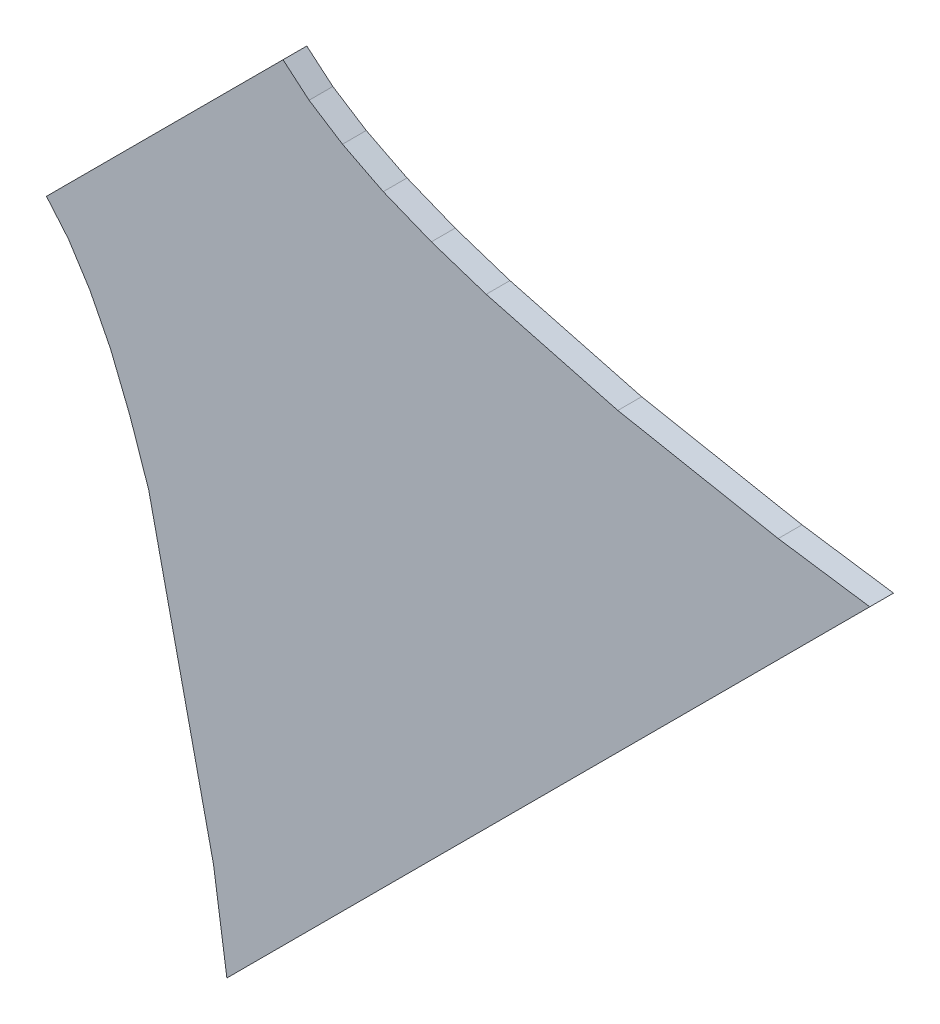
ISO-10303-21;
HEADER;
FILE_DESCRIPTION(('STEP AP214'),'2;1');
FILE_NAME('part.step','',(''),(''),'','','');
FILE_SCHEMA(('AUTOMOTIVE_DESIGN { 1 0 10303 214 1 1 1 1 }'));
ENDSEC;
DATA;
#1=APPLICATION_CONTEXT('core data for automotive mechanical design processes');
#2=APPLICATION_PROTOCOL_DEFINITION('international standard','automotive_design',2000,#1);
#3=PRODUCT_CONTEXT('',#1,'mechanical');
#4=PRODUCT('Part','Part','',(#3));
#5=PRODUCT_RELATED_PRODUCT_CATEGORY('part','',(#4));
#6=PRODUCT_DEFINITION_FORMATION('','',#4);
#7=PRODUCT_DEFINITION_CONTEXT('part definition',#1,'design');
#8=PRODUCT_DEFINITION('design','',#6,#7);
#9=PRODUCT_DEFINITION_SHAPE('','',#8);
#10=(LENGTH_UNIT() NAMED_UNIT(*) SI_UNIT(.MILLI.,.METRE.));
#11=(NAMED_UNIT(*) PLANE_ANGLE_UNIT() SI_UNIT($,.RADIAN.));
#12=(NAMED_UNIT(*) SI_UNIT($,.STERADIAN.) SOLID_ANGLE_UNIT());
#13=UNCERTAINTY_MEASURE_WITH_UNIT(LENGTH_MEASURE(1.E-05),#10,'distance_accuracy_value','');
#14=(GEOMETRIC_REPRESENTATION_CONTEXT(3) GLOBAL_UNCERTAINTY_ASSIGNED_CONTEXT((#13)) GLOBAL_UNIT_ASSIGNED_CONTEXT((#10,
#11,#12)) REPRESENTATION_CONTEXT('',''));
#15=CARTESIAN_POINT('',(0.,0.,0.));
#16=DIRECTION('',(0.,0.,1.));
#17=DIRECTION('',(1.,0.,0.));
#18=AXIS2_PLACEMENT_3D('',#15,#16,#17);
#19=CARTESIAN_POINT('',(66.468002319336,76.0579986572266,0.));
#20=DIRECTION('',(0.763425936268127,0.645895378395862,0.));
#21=DIRECTION('',(0.645895378395862,-0.763425936268127,0.));
#22=AXIS2_PLACEMENT_3D('',#19,#20,#21);
#23=PLANE('',#22);
#24=DIRECTION('',(0.645895378395862,-0.763425936268127,0.));
#25=VECTOR('',#24,1.);
#26=CARTESIAN_POINT('',(66.4680023193359,76.0579986572266,0.03556));
#27=LINE('',#26,#25);
#28=CARTESIAN_POINT('',(66.4680023193359,76.0579986572266,0.03556));
#29=VERTEX_POINT('',#28);
#30=CARTESIAN_POINT('',(66.5009994506836,76.0189971923828,0.03556));
#31=VERTEX_POINT('',#30);
#32=EDGE_CURVE('E11',#29,#31,#27,.T.);
#33=ORIENTED_EDGE('',*,*,#32,.F.);
#34=DIRECTION('',(0.,0.,1.));
#35=VECTOR('',#34,1.);
#36=CARTESIAN_POINT('',(66.4680023193359,76.0579986572266,0.));
#37=LINE('',#36,#35);
#38=CARTESIAN_POINT('',(66.4680023193359,76.0579986572266,0.));
#39=VERTEX_POINT('',#38);
#40=EDGE_CURVE('E24',#39,#29,#37,.T.);
#41=ORIENTED_EDGE('',*,*,#40,.F.);
#42=DIRECTION('',(0.645895378395862,-0.763425936268127,0.));
#43=VECTOR('',#42,1.);
#44=CARTESIAN_POINT('',(66.4680023193359,76.0579986572266,0.));
#45=LINE('',#44,#43);
#46=CARTESIAN_POINT('',(66.5009994506836,76.0189971923828,0.));
#47=VERTEX_POINT('',#46);
#48=EDGE_CURVE('E154',#39,#47,#45,.T.);
#49=ORIENTED_EDGE('',*,*,#48,.T.);
#50=DIRECTION('',(0.,0.,1.));
#51=VECTOR('',#50,1.);
#52=CARTESIAN_POINT('',(66.5009994506836,76.0189971923828,0.));
#53=LINE('',#52,#51);
#54=EDGE_CURVE('E37',#47,#31,#53,.T.);
#55=ORIENTED_EDGE('',*,*,#54,.T.);
#56=EDGE_LOOP('',(#33,#41,#49,#55));
#57=FACE_BOUND('',#56,.T.);
#58=ADVANCED_FACE('F17',(#57),#23,.F.);
#59=CARTESIAN_POINT('',(66.5009994506836,76.0189971923828,0.));
#60=DIRECTION('',(0.842266732063425,0.539060991038304,0.));
#61=DIRECTION('',(0.539060991038304,-0.842266732063425,0.));
#62=AXIS2_PLACEMENT_3D('',#59,#60,#61);
#63=PLANE('',#62);
#64=DIRECTION('',(0.539060991038304,-0.842266732063425,0.));
#65=VECTOR('',#64,1.);
#66=CARTESIAN_POINT('',(66.5009994506836,76.0189971923828,0.03556));
#67=LINE('',#66,#65);
#68=CARTESIAN_POINT('',(66.5329971313477,75.9690017700195,0.03556));
#69=VERTEX_POINT('',#68);
#70=EDGE_CURVE('E266',#31,#69,#67,.T.);
#71=ORIENTED_EDGE('',*,*,#70,.F.);
#72=ORIENTED_EDGE('',*,*,#54,.F.);
#73=DIRECTION('',(0.539060991038304,-0.842266732063425,0.));
#74=VECTOR('',#73,1.);
#75=CARTESIAN_POINT('',(66.5009994506836,76.0189971923828,0.));
#76=LINE('',#75,#74);
#77=CARTESIAN_POINT('',(66.5329971313477,75.9690017700195,0.));
#78=VERTEX_POINT('',#77);
#79=EDGE_CURVE('E263',#47,#78,#76,.T.);
#80=ORIENTED_EDGE('',*,*,#79,.T.);
#81=DIRECTION('',(0.,0.,1.));
#82=VECTOR('',#81,1.);
#83=CARTESIAN_POINT('',(66.5329971313477,75.9690017700195,0.));
#84=LINE('',#83,#82);
#85=EDGE_CURVE('E261',#78,#69,#84,.T.);
#86=ORIENTED_EDGE('',*,*,#85,.T.);
#87=EDGE_LOOP('',(#71,#72,#80,#86));
#88=FACE_BOUND('',#87,.T.);
#89=ADVANCED_FACE('F274',(#88),#63,.F.);
#90=CARTESIAN_POINT('',(66.5329971313477,75.9690017700195,0.));
#91=DIRECTION('',(0.891464515087976,0.453090518924154,0.));
#92=DIRECTION('',(0.453090518924154,-0.891464515087976,0.));
#93=AXIS2_PLACEMENT_3D('',#90,#91,#92);
#94=PLANE('',#93);
#95=DIRECTION('',(0.453090518924154,-0.891464515087976,0.));
#96=VECTOR('',#95,1.);
#97=CARTESIAN_POINT('',(66.5329971313477,75.9690017700195,0.03556));
#98=LINE('',#97,#96);
#99=CARTESIAN_POINT('',(66.5640029907227,75.9079971313477,0.03556));
#100=VERTEX_POINT('',#99);
#101=EDGE_CURVE('E258',#69,#100,#98,.T.);
#102=ORIENTED_EDGE('',*,*,#101,.F.);
#103=ORIENTED_EDGE('',*,*,#85,.F.);
#104=DIRECTION('',(0.453090518924154,-0.891464515087976,0.));
#105=VECTOR('',#104,1.);
#106=CARTESIAN_POINT('',(66.5329971313477,75.9690017700195,0.));
#107=LINE('',#106,#105);
#108=CARTESIAN_POINT('',(66.5640029907227,75.9079971313477,0.));
#109=VERTEX_POINT('',#108);
#110=EDGE_CURVE('E255',#78,#109,#107,.T.);
#111=ORIENTED_EDGE('',*,*,#110,.T.);
#112=DIRECTION('',(0.,0.,1.));
#113=VECTOR('',#112,1.);
#114=CARTESIAN_POINT('',(66.5640029907227,75.9079971313477,0.));
#115=LINE('',#114,#113);
#116=EDGE_CURVE('E253',#109,#100,#115,.T.);
#117=ORIENTED_EDGE('',*,*,#116,.T.);
#118=EDGE_LOOP('',(#102,#103,#111,#117));
#119=FACE_BOUND('',#118,.T.);
#120=ADVANCED_FACE('F280',(#119),#94,.F.);
#121=CARTESIAN_POINT('',(66.5640029907227,75.9079971313477,0.));
#122=DIRECTION('',(0.927586015125425,0.373609668696804,0.));
#123=DIRECTION('',(0.373609668696804,-0.927586015125425,0.));
#124=AXIS2_PLACEMENT_3D('',#121,#122,#123);
#125=PLANE('',#124);
#126=DIRECTION('',(0.373609668696804,-0.927586015125425,0.));
#127=VECTOR('',#126,1.);
#128=CARTESIAN_POINT('',(66.5640029907227,75.9079971313477,0.03556));
#129=LINE('',#128,#127);
#130=CARTESIAN_POINT('',(66.5930023193359,75.8359985351562,0.03556));
#131=VERTEX_POINT('',#130);
#132=EDGE_CURVE('E250',#100,#131,#129,.T.);
#133=ORIENTED_EDGE('',*,*,#132,.F.);
#134=ORIENTED_EDGE('',*,*,#116,.F.);
#135=DIRECTION('',(0.373609668696804,-0.927586015125425,0.));
#136=VECTOR('',#135,1.);
#137=CARTESIAN_POINT('',(66.5640029907227,75.9079971313477,0.));
#138=LINE('',#137,#136);
#139=CARTESIAN_POINT('',(66.5930023193359,75.8359985351562,0.));
#140=VERTEX_POINT('',#139);
#141=EDGE_CURVE('E247',#109,#140,#138,.T.);
#142=ORIENTED_EDGE('',*,*,#141,.T.);
#143=DIRECTION('',(0.,0.,1.));
#144=VECTOR('',#143,1.);
#145=CARTESIAN_POINT('',(66.5930023193359,75.8359985351562,0.));
#146=LINE('',#145,#144);
#147=EDGE_CURVE('E245',#140,#131,#146,.T.);
#148=ORIENTED_EDGE('',*,*,#147,.T.);
#149=EDGE_LOOP('',(#133,#134,#142,#148));
#150=FACE_BOUND('',#149,.T.);
#151=ADVANCED_FACE('F282',(#150),#125,.F.);
#152=CARTESIAN_POINT('',(66.593002319336,75.8359985351562,0.));
#153=DIRECTION('',(0.946351169524934,0.323140006713482,0.));
#154=DIRECTION('',(0.323140006713482,-0.946351169524934,0.));
#155=AXIS2_PLACEMENT_3D('',#152,#153,#154);
#156=PLANE('',#155);
#157=DIRECTION('',(0.323140006713482,-0.946351169524934,0.));
#158=VECTOR('',#157,1.);
#159=CARTESIAN_POINT('',(66.5930023193359,75.8359985351562,0.03556));
#160=LINE('',#159,#158);
#161=CARTESIAN_POINT('',(66.6210021972656,75.7539978027344,0.03556));
#162=VERTEX_POINT('',#161);
#163=EDGE_CURVE('E242',#131,#162,#160,.T.);
#164=ORIENTED_EDGE('',*,*,#163,.F.);
#165=ORIENTED_EDGE('',*,*,#147,.F.);
#166=DIRECTION('',(0.323140006713482,-0.946351169524934,0.));
#167=VECTOR('',#166,1.);
#168=CARTESIAN_POINT('',(66.5930023193359,75.8359985351562,0.));
#169=LINE('',#168,#167);
#170=CARTESIAN_POINT('',(66.6210021972656,75.7539978027344,0.));
#171=VERTEX_POINT('',#170);
#172=EDGE_CURVE('E239',#140,#171,#169,.T.);
#173=ORIENTED_EDGE('',*,*,#172,.T.);
#174=DIRECTION('',(0.,0.,1.));
#175=VECTOR('',#174,1.);
#176=CARTESIAN_POINT('',(66.6210021972656,75.7539978027344,0.));
#177=LINE('',#176,#175);
#178=EDGE_CURVE('E237',#171,#162,#177,.T.);
#179=ORIENTED_EDGE('',*,*,#178,.T.);
#180=EDGE_LOOP('',(#164,#165,#173,#179));
#181=FACE_BOUND('',#180,.T.);
#182=ADVANCED_FACE('F287',(#181),#156,.F.);
#183=CARTESIAN_POINT('',(66.6210021972656,75.7539978027344,0.));
#184=DIRECTION('',(0.97623916620404,0.216695847604982,0.));
#185=DIRECTION('',(0.216695847604982,-0.97623916620404,0.));
#186=AXIS2_PLACEMENT_3D('',#183,#184,#185);
#187=PLANE('',#186);
#188=DIRECTION('',(0.216695847604982,-0.97623916620404,0.));
#189=VECTOR('',#188,1.);
#190=CARTESIAN_POINT('',(66.6210021972656,75.7539978027344,0.03556));
#191=LINE('',#190,#189);
#192=CARTESIAN_POINT('',(66.7180023193359,75.3170013427734,0.03556));
#193=VERTEX_POINT('',#192);
#194=EDGE_CURVE('E234',#162,#193,#191,.T.);
#195=ORIENTED_EDGE('',*,*,#194,.F.);
#196=ORIENTED_EDGE('',*,*,#178,.F.);
#197=DIRECTION('',(0.216695847604982,-0.97623916620404,0.));
#198=VECTOR('',#197,1.);
#199=CARTESIAN_POINT('',(66.6210021972656,75.7539978027344,0.));
#200=LINE('',#199,#198);
#201=CARTESIAN_POINT('',(66.7180023193359,75.3170013427734,0.));
#202=VERTEX_POINT('',#201);
#203=EDGE_CURVE('E231',#171,#202,#200,.T.);
#204=ORIENTED_EDGE('',*,*,#203,.T.);
#205=DIRECTION('',(0.,0.,1.));
#206=VECTOR('',#205,1.);
#207=CARTESIAN_POINT('',(66.7180023193359,75.3170013427734,0.));
#208=LINE('',#207,#206);
#209=EDGE_CURVE('E229',#202,#193,#208,.T.);
#210=ORIENTED_EDGE('',*,*,#209,.T.);
#211=EDGE_LOOP('',(#195,#196,#204,#210));
#212=FACE_BOUND('',#211,.T.);
#213=ADVANCED_FACE('F290',(#212),#187,.F.);
#214=CARTESIAN_POINT('',(66.718002319336,75.3170013427734,0.));
#215=DIRECTION('',(0.989515104847353,0.144429419714034,0.));
#216=DIRECTION('',(0.144429419714034,-0.989515104847353,0.));
#217=AXIS2_PLACEMENT_3D('',#214,#215,#216);
#218=PLANE('',#217);
#219=DIRECTION('',(0.144429419714034,-0.989515104847353,0.));
#220=VECTOR('',#219,1.);
#221=CARTESIAN_POINT('',(66.7180023193359,75.3170013427734,0.03556));
#222=LINE('',#221,#220);
#223=CARTESIAN_POINT('',(66.7379989624023,75.1800003051758,0.03556));
#224=VERTEX_POINT('',#223);
#225=EDGE_CURVE('E226',#193,#224,#222,.T.);
#226=ORIENTED_EDGE('',*,*,#225,.F.);
#227=ORIENTED_EDGE('',*,*,#209,.F.);
#228=DIRECTION('',(0.144429419714034,-0.989515104847353,0.));
#229=VECTOR('',#228,1.);
#230=CARTESIAN_POINT('',(66.7180023193359,75.3170013427734,0.));
#231=LINE('',#230,#229);
#232=CARTESIAN_POINT('',(66.7379989624023,75.1800003051758,0.));
#233=VERTEX_POINT('',#232);
#234=EDGE_CURVE('E223',#202,#233,#231,.T.);
#235=ORIENTED_EDGE('',*,*,#234,.T.);
#236=DIRECTION('',(0.,0.,1.));
#237=VECTOR('',#236,1.);
#238=CARTESIAN_POINT('',(66.7379989624023,75.1800003051758,0.));
#239=LINE('',#238,#237);
#240=EDGE_CURVE('E221',#233,#224,#239,.T.);
#241=ORIENTED_EDGE('',*,*,#240,.T.);
#242=EDGE_LOOP('',(#226,#227,#235,#241));
#243=FACE_BOUND('',#242,.T.);
#244=ADVANCED_FACE('F295',(#243),#218,.F.);
#245=CARTESIAN_POINT('',(66.7379989624023,75.1800003051758,0.));
#246=DIRECTION('',(-0.707106781186548,0.707106781186548,0.));
#247=DIRECTION('',(0.707106781186548,0.707106781186548,0.));
#248=AXIS2_PLACEMENT_3D('',#245,#246,#247);
#249=PLANE('',#248);
#250=DIRECTION('',(0.707106781186548,0.707106781186548,0.));
#251=VECTOR('',#250,1.);
#252=CARTESIAN_POINT('',(66.7379989624023,75.1800003051758,0.03556));
#253=LINE('',#252,#251);
#254=CARTESIAN_POINT('',(67.6999969482422,76.1419982910156,0.03556));
#255=VERTEX_POINT('',#254);
#256=EDGE_CURVE('E218',#224,#255,#253,.T.);
#257=ORIENTED_EDGE('',*,*,#256,.F.);
#258=ORIENTED_EDGE('',*,*,#240,.F.);
#259=DIRECTION('',(0.707106781186548,0.707106781186548,0.));
#260=VECTOR('',#259,1.);
#261=CARTESIAN_POINT('',(66.7379989624023,75.1800003051758,0.));
#262=LINE('',#261,#260);
#263=CARTESIAN_POINT('',(67.6999969482422,76.1419982910156,0.));
#264=VERTEX_POINT('',#263);
#265=EDGE_CURVE('E215',#233,#264,#262,.T.);
#266=ORIENTED_EDGE('',*,*,#265,.T.);
#267=DIRECTION('',(0.,0.,1.));
#268=VECTOR('',#267,1.);
#269=CARTESIAN_POINT('',(67.6999969482422,76.1419982910156,0.));
#270=LINE('',#269,#268);
#271=EDGE_CURVE('E213',#264,#255,#270,.T.);
#272=ORIENTED_EDGE('',*,*,#271,.T.);
#273=EDGE_LOOP('',(#257,#258,#266,#272));
#274=FACE_BOUND('',#273,.T.);
#275=ADVANCED_FACE('F298',(#274),#249,.F.);
#276=CARTESIAN_POINT('',(67.6999969482422,76.1419982910156,0.));
#277=DIRECTION('',(-0.144491252828946,-0.989506077725611,0.));
#278=DIRECTION('',(-0.989506077725611,0.144491252828946,0.));
#279=AXIS2_PLACEMENT_3D('',#276,#277,#278);
#280=PLANE('',#279);
#281=DIRECTION('',(-0.989506077725611,0.144491252828946,0.));
#282=VECTOR('',#281,1.);
#283=CARTESIAN_POINT('',(67.6999969482422,76.1419982910156,0.03556));
#284=LINE('',#283,#282);
#285=CARTESIAN_POINT('',(67.5630035400391,76.1620025634766,0.03556));
#286=VERTEX_POINT('',#285);
#287=EDGE_CURVE('E210',#255,#286,#284,.T.);
#288=ORIENTED_EDGE('',*,*,#287,.F.);
#289=ORIENTED_EDGE('',*,*,#271,.F.);
#290=DIRECTION('',(-0.989506077725611,0.144491252828946,0.));
#291=VECTOR('',#290,1.);
#292=CARTESIAN_POINT('',(67.6999969482422,76.1419982910156,0.));
#293=LINE('',#292,#291);
#294=CARTESIAN_POINT('',(67.5630035400391,76.1620025634766,0.));
#295=VERTEX_POINT('',#294);
#296=EDGE_CURVE('E207',#264,#295,#293,.T.);
#297=ORIENTED_EDGE('',*,*,#296,.T.);
#298=DIRECTION('',(0.,0.,1.));
#299=VECTOR('',#298,1.);
#300=CARTESIAN_POINT('',(67.5630035400391,76.1620025634766,0.));
#301=LINE('',#300,#299);
#302=EDGE_CURVE('E205',#295,#286,#301,.T.);
#303=ORIENTED_EDGE('',*,*,#302,.T.);
#304=EDGE_LOOP('',(#288,#289,#297,#303));
#305=FACE_BOUND('',#304,.T.);
#306=ADVANCED_FACE('F303',(#305),#280,.F.);
#307=CARTESIAN_POINT('',(67.5630035400391,76.1620025634766,0.));
#308=DIRECTION('',(-0.188226692657996,-0.982125609161594,0.));
#309=DIRECTION('',(-0.982125609161594,0.188226692657996,0.));
#310=AXIS2_PLACEMENT_3D('',#307,#308,#309);
#311=PLANE('',#310);
#312=DIRECTION('',(-0.982125609161594,0.188226692657996,0.));
#313=VECTOR('',#312,1.);
#314=CARTESIAN_POINT('',(67.5630035400391,76.1620025634766,0.03556));
#315=LINE('',#314,#313);
#316=CARTESIAN_POINT('',(67.322998046875,76.2080001831055,0.03556));
#317=VERTEX_POINT('',#316);
#318=EDGE_CURVE('E202',#286,#317,#315,.T.);
#319=ORIENTED_EDGE('',*,*,#318,.F.);
#320=ORIENTED_EDGE('',*,*,#302,.F.);
#321=DIRECTION('',(-0.982125609161594,0.188226692657996,0.));
#322=VECTOR('',#321,1.);
#323=CARTESIAN_POINT('',(67.5630035400391,76.1620025634766,0.));
#324=LINE('',#323,#322);
#325=CARTESIAN_POINT('',(67.322998046875,76.2080001831055,0.));
#326=VERTEX_POINT('',#325);
#327=EDGE_CURVE('E199',#295,#326,#324,.T.);
#328=ORIENTED_EDGE('',*,*,#327,.T.);
#329=DIRECTION('',(0.,0.,1.));
#330=VECTOR('',#329,1.);
#331=CARTESIAN_POINT('',(67.322998046875,76.2080001831055,0.));
#332=LINE('',#331,#330);
#333=EDGE_CURVE('E197',#326,#317,#332,.T.);
#334=ORIENTED_EDGE('',*,*,#333,.T.);
#335=EDGE_LOOP('',(#319,#320,#328,#334));
#336=FACE_BOUND('',#335,.T.);
#337=ADVANCED_FACE('F306',(#336),#311,.F.);
#338=CARTESIAN_POINT('',(67.322998046875,76.2080001831055,0.));
#339=DIRECTION('',(-0.255228651788377,-0.966880724446551,0.));
#340=DIRECTION('',(-0.966880724446551,0.255228651788377,0.));
#341=AXIS2_PLACEMENT_3D('',#338,#339,#340);
#342=PLANE('',#341);
#343=DIRECTION('',(-0.966880724446551,0.255228651788377,0.));
#344=VECTOR('',#343,1.);
#345=CARTESIAN_POINT('',(67.322998046875,76.2080001831055,0.03556));
#346=LINE('',#345,#344);
#347=CARTESIAN_POINT('',(67.1259994506836,76.2600021362305,0.03556));
#348=VERTEX_POINT('',#347);
#349=EDGE_CURVE('E194',#317,#348,#346,.T.);
#350=ORIENTED_EDGE('',*,*,#349,.F.);
#351=ORIENTED_EDGE('',*,*,#333,.F.);
#352=DIRECTION('',(-0.966880724446551,0.255228651788377,0.));
#353=VECTOR('',#352,1.);
#354=CARTESIAN_POINT('',(67.322998046875,76.2080001831055,0.));
#355=LINE('',#354,#353);
#356=CARTESIAN_POINT('',(67.1259994506836,76.2600021362305,0.));
#357=VERTEX_POINT('',#356);
#358=EDGE_CURVE('E191',#326,#357,#355,.T.);
#359=ORIENTED_EDGE('',*,*,#358,.T.);
#360=DIRECTION('',(0.,0.,1.));
#361=VECTOR('',#360,1.);
#362=CARTESIAN_POINT('',(67.1259994506836,76.2600021362305,0.));
#363=LINE('',#362,#361);
#364=EDGE_CURVE('E189',#357,#348,#363,.T.);
#365=ORIENTED_EDGE('',*,*,#364,.T.);
#366=EDGE_LOOP('',(#350,#351,#359,#365));
#367=FACE_BOUND('',#366,.T.);
#368=ADVANCED_FACE('F311',(#367),#342,.F.);
#369=CARTESIAN_POINT('',(67.1259994506836,76.2600021362305,0.));
#370=DIRECTION('',(-0.312752582059084,-0.949834628983054,0.));
#371=DIRECTION('',(-0.949834628983054,0.312752582059084,0.));
#372=AXIS2_PLACEMENT_3D('',#369,#370,#371);
#373=PLANE('',#372);
#374=DIRECTION('',(-0.949834628983054,0.312752582059084,0.));
#375=VECTOR('',#374,1.);
#376=CARTESIAN_POINT('',(67.1259994506836,76.2600021362305,0.03556));
#377=LINE('',#376,#375);
#378=CARTESIAN_POINT('',(67.0439987182617,76.2870025634766,0.03556));
#379=VERTEX_POINT('',#378);
#380=EDGE_CURVE('E186',#348,#379,#377,.T.);
#381=ORIENTED_EDGE('',*,*,#380,.F.);
#382=ORIENTED_EDGE('',*,*,#364,.F.);
#383=DIRECTION('',(-0.949834628983054,0.312752582059084,0.));
#384=VECTOR('',#383,1.);
#385=CARTESIAN_POINT('',(67.1259994506836,76.2600021362305,0.));
#386=LINE('',#385,#384);
#387=CARTESIAN_POINT('',(67.0439987182617,76.2870025634766,0.));
#388=VERTEX_POINT('',#387);
#389=EDGE_CURVE('E183',#357,#388,#386,.T.);
#390=ORIENTED_EDGE('',*,*,#389,.T.);
#391=DIRECTION('',(0.,0.,1.));
#392=VECTOR('',#391,1.);
#393=CARTESIAN_POINT('',(67.0439987182617,76.2870025634766,0.));
#394=LINE('',#393,#392);
#395=EDGE_CURVE('E181',#388,#379,#394,.T.);
#396=ORIENTED_EDGE('',*,*,#395,.T.);
#397=EDGE_LOOP('',(#381,#382,#390,#396));
#398=FACE_BOUND('',#397,.T.);
#399=ADVANCED_FACE('F314',(#398),#373,.F.);
#400=CARTESIAN_POINT('',(67.0439987182617,76.2870025634766,0.));
#401=DIRECTION('',(-0.373609668696804,-0.927586015125425,0.));
#402=DIRECTION('',(-0.927586015125425,0.373609668696804,0.));
#403=AXIS2_PLACEMENT_3D('',#400,#401,#402);
#404=PLANE('',#403);
#405=DIRECTION('',(-0.927586015125425,0.373609668696804,0.));
#406=VECTOR('',#405,1.);
#407=CARTESIAN_POINT('',(67.0439987182617,76.2870025634766,0.03556));
#408=LINE('',#407,#406);
#409=CARTESIAN_POINT('',(66.9720001220703,76.3160018920898,0.03556));
#410=VERTEX_POINT('',#409);
#411=EDGE_CURVE('E178',#379,#410,#408,.T.);
#412=ORIENTED_EDGE('',*,*,#411,.F.);
#413=ORIENTED_EDGE('',*,*,#395,.F.);
#414=DIRECTION('',(-0.927586015125425,0.373609668696804,0.));
#415=VECTOR('',#414,1.);
#416=CARTESIAN_POINT('',(67.0439987182617,76.2870025634766,0.));
#417=LINE('',#416,#415);
#418=CARTESIAN_POINT('',(66.9720001220703,76.3160018920898,0.));
#419=VERTEX_POINT('',#418);
#420=EDGE_CURVE('E175',#388,#419,#417,.T.);
#421=ORIENTED_EDGE('',*,*,#420,.T.);
#422=DIRECTION('',(0.,0.,1.));
#423=VECTOR('',#422,1.);
#424=CARTESIAN_POINT('',(66.9720001220703,76.3160018920898,0.));
#425=LINE('',#424,#423);
#426=EDGE_CURVE('E173',#419,#410,#425,.T.);
#427=ORIENTED_EDGE('',*,*,#426,.T.);
#428=EDGE_LOOP('',(#412,#413,#421,#427));
#429=FACE_BOUND('',#428,.T.);
#430=ADVANCED_FACE('F319',(#429),#404,.F.);
#431=CARTESIAN_POINT('',(66.9720001220703,76.3160018920898,0.));
#432=DIRECTION('',(-0.453046942597137,-0.891486661595891,0.));
#433=DIRECTION('',(-0.891486661595891,0.453046942597137,0.));
#434=AXIS2_PLACEMENT_3D('',#431,#432,#433);
#435=PLANE('',#434);
#436=DIRECTION('',(-0.891486661595891,0.453046942597137,0.));
#437=VECTOR('',#436,1.);
#438=CARTESIAN_POINT('',(66.9720001220703,76.3160018920898,0.03556));
#439=LINE('',#438,#437);
#440=CARTESIAN_POINT('',(66.911003112793,76.3470001220703,0.03556));
#441=VERTEX_POINT('',#440);
#442=EDGE_CURVE('E170',#410,#441,#439,.T.);
#443=ORIENTED_EDGE('',*,*,#442,.F.);
#444=ORIENTED_EDGE('',*,*,#426,.F.);
#445=DIRECTION('',(-0.891486661595891,0.453046942597137,0.));
#446=VECTOR('',#445,1.);
#447=CARTESIAN_POINT('',(66.9720001220703,76.3160018920898,0.));
#448=LINE('',#447,#446);
#449=CARTESIAN_POINT('',(66.911003112793,76.3470001220703,0.));
#450=VERTEX_POINT('',#449);
#451=EDGE_CURVE('E167',#419,#450,#448,.T.);
#452=ORIENTED_EDGE('',*,*,#451,.T.);
#453=DIRECTION('',(0.,0.,1.));
#454=VECTOR('',#453,1.);
#455=CARTESIAN_POINT('',(66.911003112793,76.3470001220703,0.));
#456=LINE('',#455,#454);
#457=EDGE_CURVE('E165',#450,#441,#456,.T.);
#458=ORIENTED_EDGE('',*,*,#457,.T.);
#459=EDGE_LOOP('',(#443,#444,#452,#458));
#460=FACE_BOUND('',#459,.T.);
#461=ADVANCED_FACE('F322',(#460),#435,.F.);
#462=CARTESIAN_POINT('',(66.911003112793,76.3470001220703,0.));
#463=DIRECTION('',(-0.539002638514335,-0.842304075541954,0.));
#464=DIRECTION('',(-0.842304075541954,0.539002638514335,0.));
#465=AXIS2_PLACEMENT_3D('',#462,#463,#464);
#466=PLANE('',#465);
#467=DIRECTION('',(-0.842304075541954,0.539002638514335,0.));
#468=VECTOR('',#467,1.);
#469=CARTESIAN_POINT('',(66.911003112793,76.3470001220703,0.03556));
#470=LINE('',#469,#468);
#471=CARTESIAN_POINT('',(66.8610000610352,76.3789978027344,0.03556));
#472=VERTEX_POINT('',#471);
#473=EDGE_CURVE('E162',#441,#472,#470,.T.);
#474=ORIENTED_EDGE('',*,*,#473,.F.);
#475=ORIENTED_EDGE('',*,*,#457,.F.);
#476=DIRECTION('',(-0.842304075541954,0.539002638514335,0.));
#477=VECTOR('',#476,1.);
#478=CARTESIAN_POINT('',(66.911003112793,76.3470001220703,0.));
#479=LINE('',#478,#477);
#480=CARTESIAN_POINT('',(66.8610000610352,76.3789978027344,0.));
#481=VERTEX_POINT('',#480);
#482=EDGE_CURVE('E160',#450,#481,#479,.T.);
#483=ORIENTED_EDGE('',*,*,#482,.T.);
#484=DIRECTION('',(0.,0.,1.));
#485=VECTOR('',#484,1.);
#486=CARTESIAN_POINT('',(66.8610000610352,76.3789978027344,0.));
#487=LINE('',#486,#485);
#488=EDGE_CURVE('E145',#481,#472,#487,.T.);
#489=ORIENTED_EDGE('',*,*,#488,.T.);
#490=EDGE_LOOP('',(#474,#475,#483,#489));
#491=FACE_BOUND('',#490,.T.);
#492=ADVANCED_FACE('F325',(#491),#466,.F.);
#493=CARTESIAN_POINT('',(66.8610000610352,76.3789978027344,0.));
#494=DIRECTION('',(-0.645982404000613,-0.763352299873124,0.));
#495=DIRECTION('',(-0.763352299873124,0.645982404000613,0.));
#496=AXIS2_PLACEMENT_3D('',#493,#494,#495);
#497=PLANE('',#496);
#498=DIRECTION('',(-0.763352299873124,0.645982404000613,0.));
#499=VECTOR('',#498,1.);
#500=CARTESIAN_POINT('',(66.8610000610352,76.3789978027344,0.03556));
#501=LINE('',#500,#499);
#502=CARTESIAN_POINT('',(66.8219985961914,76.4120025634766,0.03556));
#503=VERTEX_POINT('',#502);
#504=EDGE_CURVE('E149',#472,#503,#501,.T.);
#505=ORIENTED_EDGE('',*,*,#504,.F.);
#506=ORIENTED_EDGE('',*,*,#488,.F.);
#507=DIRECTION('',(-0.763352299873124,0.645982404000613,0.));
#508=VECTOR('',#507,1.);
#509=CARTESIAN_POINT('',(66.8610000610352,76.3789978027344,0.));
#510=LINE('',#509,#508);
#511=CARTESIAN_POINT('',(66.8219985961914,76.4120025634766,0.));
#512=VERTEX_POINT('',#511);
#513=EDGE_CURVE('E141',#481,#512,#510,.T.);
#514=ORIENTED_EDGE('',*,*,#513,.T.);
#515=DIRECTION('',(0.,0.,1.));
#516=VECTOR('',#515,1.);
#517=CARTESIAN_POINT('',(66.8219985961914,76.4120025634766,0.));
#518=LINE('',#517,#516);
#519=EDGE_CURVE('E131',#512,#503,#518,.T.);
#520=ORIENTED_EDGE('',*,*,#519,.T.);
#521=EDGE_LOOP('',(#505,#506,#514,#520));
#522=FACE_BOUND('',#521,.T.);
#523=ADVANCED_FACE('F144',(#522),#497,.F.);
#524=CARTESIAN_POINT('',(66.8219985961914,76.4120025634766,0.));
#525=DIRECTION('',(0.707114400912744,-0.707099161378241,0.));
#526=DIRECTION('',(-0.707099161378241,-0.707114400912744,0.));
#527=AXIS2_PLACEMENT_3D('',#524,#525,#526);
#528=PLANE('',#527);
#529=DIRECTION('',(-0.707099161378241,-0.707114400912744,0.));
#530=VECTOR('',#529,1.);
#531=CARTESIAN_POINT('',(66.8219985961914,76.4120025634766,0.03556));
#532=LINE('',#531,#530);
#533=EDGE_CURVE('E137',#503,#29,#532,.T.);
#534=ORIENTED_EDGE('',*,*,#533,.F.);
#535=ORIENTED_EDGE('',*,*,#519,.F.);
#536=DIRECTION('',(-0.707099161378241,-0.707114400912744,0.));
#537=VECTOR('',#536,1.);
#538=CARTESIAN_POINT('',(66.8219985961914,76.4120025634766,0.));
#539=LINE('',#538,#537);
#540=EDGE_CURVE('E135',#512,#39,#539,.T.);
#541=ORIENTED_EDGE('',*,*,#540,.T.);
#542=ORIENTED_EDGE('',*,*,#40,.T.);
#543=EDGE_LOOP('',(#534,#535,#541,#542));
#544=FACE_BOUND('',#543,.T.);
#545=ADVANCED_FACE('F133',(#544),#528,.F.);
#546=CARTESIAN_POINT('',(66.468002319336,76.0579986572266,0.));
#547=DIRECTION('',(0.,0.,1.));
#548=DIRECTION('',(1.,0.,0.));
#549=AXIS2_PLACEMENT_3D('',#546,#547,#548);
#550=PLANE('',#549);
#551=ORIENTED_EDGE('',*,*,#540,.F.);
#552=ORIENTED_EDGE('',*,*,#513,.F.);
#553=ORIENTED_EDGE('',*,*,#482,.F.);
#554=ORIENTED_EDGE('',*,*,#451,.F.);
#555=ORIENTED_EDGE('',*,*,#420,.F.);
#556=ORIENTED_EDGE('',*,*,#389,.F.);
#557=ORIENTED_EDGE('',*,*,#358,.F.);
#558=ORIENTED_EDGE('',*,*,#327,.F.);
#559=ORIENTED_EDGE('',*,*,#296,.F.);
#560=ORIENTED_EDGE('',*,*,#265,.F.);
#561=ORIENTED_EDGE('',*,*,#234,.F.);
#562=ORIENTED_EDGE('',*,*,#203,.F.);
#563=ORIENTED_EDGE('',*,*,#172,.F.);
#564=ORIENTED_EDGE('',*,*,#141,.F.);
#565=ORIENTED_EDGE('',*,*,#110,.F.);
#566=ORIENTED_EDGE('',*,*,#79,.F.);
#567=ORIENTED_EDGE('',*,*,#48,.F.);
#568=EDGE_LOOP('',(#551,#552,#553,#554,#555,#556,#557,#558,#559,#560,#561,#562,#563,#564,#565,
#566,#567));
#569=FACE_BOUND('',#568,.T.);
#570=ADVANCED_FACE('F152',(#569),#550,.F.);
#571=CARTESIAN_POINT('',(66.468002319336,76.0579986572266,0.03556));
#572=DIRECTION('',(0.,0.,1.));
#573=DIRECTION('',(1.,0.,0.));
#574=AXIS2_PLACEMENT_3D('',#571,#572,#573);
#575=PLANE('',#574);
#576=ORIENTED_EDGE('',*,*,#32,.T.);
#577=ORIENTED_EDGE('',*,*,#70,.T.);
#578=ORIENTED_EDGE('',*,*,#101,.T.);
#579=ORIENTED_EDGE('',*,*,#132,.T.);
#580=ORIENTED_EDGE('',*,*,#163,.T.);
#581=ORIENTED_EDGE('',*,*,#194,.T.);
#582=ORIENTED_EDGE('',*,*,#225,.T.);
#583=ORIENTED_EDGE('',*,*,#256,.T.);
#584=ORIENTED_EDGE('',*,*,#287,.T.);
#585=ORIENTED_EDGE('',*,*,#318,.T.);
#586=ORIENTED_EDGE('',*,*,#349,.T.);
#587=ORIENTED_EDGE('',*,*,#380,.T.);
#588=ORIENTED_EDGE('',*,*,#411,.T.);
#589=ORIENTED_EDGE('',*,*,#442,.T.);
#590=ORIENTED_EDGE('',*,*,#473,.T.);
#591=ORIENTED_EDGE('',*,*,#504,.T.);
#592=ORIENTED_EDGE('',*,*,#533,.T.);
#593=EDGE_LOOP('',(#576,#577,#578,#579,#580,#581,#582,#583,#584,#585,#586,#587,#588,#589,#590,
#591,#592));
#594=FACE_BOUND('',#593,.T.);
#595=ADVANCED_FACE('F277',(#594),#575,.T.);
#596=CLOSED_SHELL('',(#58,#89,#120,#151,#182,#213,#244,#275,#306,#337,#368,#399,#430,#461,#492,
#523,#545,#570,#595));
#597=MANIFOLD_SOLID_BREP('B1',#596);
#598=ADVANCED_BREP_SHAPE_REPRESENTATION('',(#18,#597),#14);
#599=SHAPE_DEFINITION_REPRESENTATION(#9,#598);
ENDSEC;
END-ISO-10303-21;
